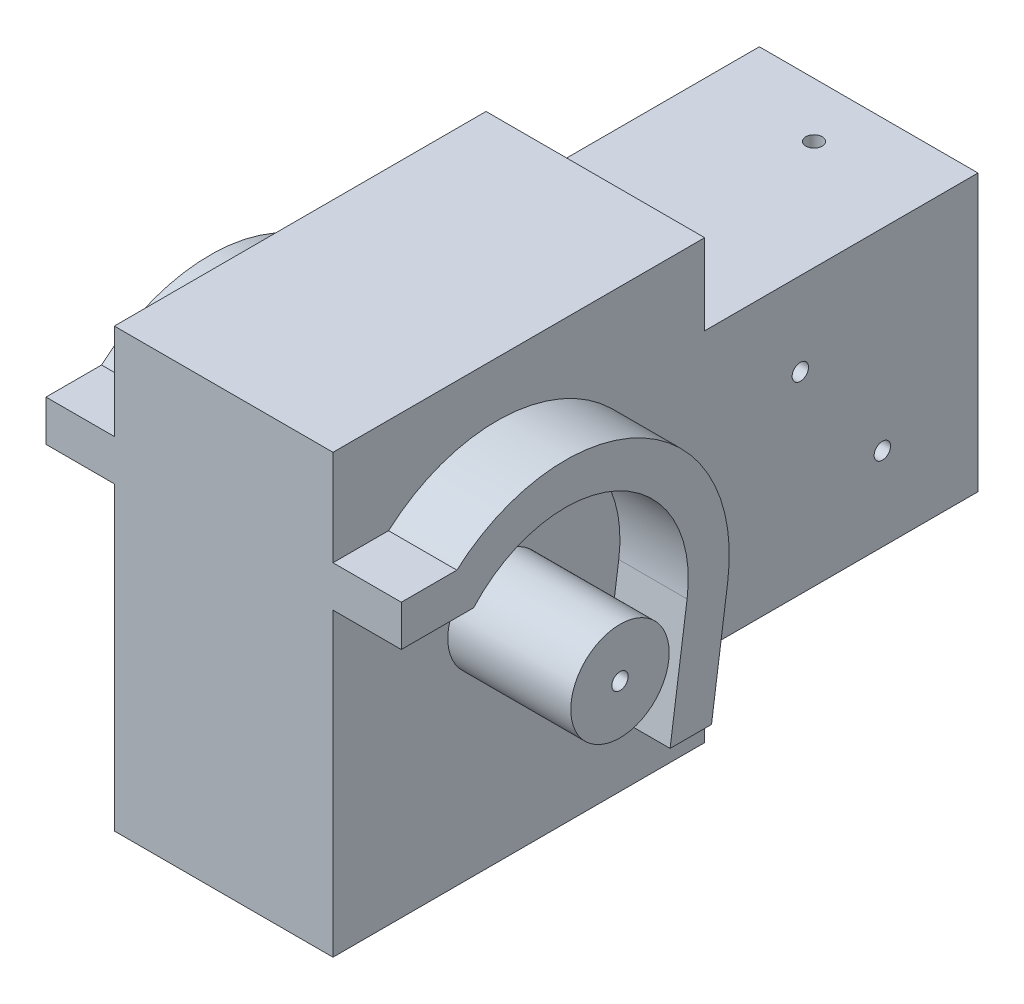
ISO-10303-21;
HEADER;
FILE_DESCRIPTION(('STEP AP214'),'2;1');
FILE_NAME('part.step','',(''),(''),'','','');
FILE_SCHEMA(('AUTOMOTIVE_DESIGN { 1 0 10303 214 1 1 1 1 }'));
ENDSEC;
DATA;
#1=APPLICATION_CONTEXT('core data for automotive mechanical design processes');
#2=APPLICATION_PROTOCOL_DEFINITION('international standard','automotive_design',2000,#1);
#3=PRODUCT_CONTEXT('',#1,'mechanical');
#4=PRODUCT('Part','Part','',(#3));
#5=PRODUCT_RELATED_PRODUCT_CATEGORY('part','',(#4));
#6=PRODUCT_DEFINITION_FORMATION('','',#4);
#7=PRODUCT_DEFINITION_CONTEXT('part definition',#1,'design');
#8=PRODUCT_DEFINITION('design','',#6,#7);
#9=PRODUCT_DEFINITION_SHAPE('','',#8);
#10=(LENGTH_UNIT() NAMED_UNIT(*) SI_UNIT(.MILLI.,.METRE.));
#11=(NAMED_UNIT(*) PLANE_ANGLE_UNIT() SI_UNIT($,.RADIAN.));
#12=(NAMED_UNIT(*) SI_UNIT($,.STERADIAN.) SOLID_ANGLE_UNIT());
#13=UNCERTAINTY_MEASURE_WITH_UNIT(LENGTH_MEASURE(1.E-05),#10,'distance_accuracy_value','');
#14=(GEOMETRIC_REPRESENTATION_CONTEXT(3) GLOBAL_UNCERTAINTY_ASSIGNED_CONTEXT((#13)) GLOBAL_UNIT_ASSIGNED_CONTEXT((#10,
#11,#12)) REPRESENTATION_CONTEXT('',''));
#15=CARTESIAN_POINT('',(0.,0.,0.));
#16=DIRECTION('',(0.,0.,1.));
#17=DIRECTION('',(1.,0.,0.));
#18=AXIS2_PLACEMENT_3D('',#15,#16,#17);
#19=CARTESIAN_POINT('',(4.,-8.,6.));
#20=DIRECTION('',(0.,1.,0.));
#21=DIRECTION('',(0.,0.,1.));
#22=AXIS2_PLACEMENT_3D('',#19,#20,#21);
#23=PLANE('',#22);
#24=DIRECTION('',(-1.,0.,0.));
#25=VECTOR('',#24,1.);
#26=CARTESIAN_POINT('',(0.,-8.,-7.6));
#27=LINE('',#26,#25);
#28=CARTESIAN_POINT('',(4.,-8.,-7.6));
#29=VERTEX_POINT('',#28);
#30=CARTESIAN_POINT('',(-4.,-8.,-7.6));
#31=VERTEX_POINT('',#30);
#32=EDGE_CURVE('E303',#29,#31,#27,.T.);
#33=ORIENTED_EDGE('',*,*,#32,.F.);
#34=DIRECTION('',(0.,0.,-1.));
#35=VECTOR('',#34,1.);
#36=CARTESIAN_POINT('',(4.,-8.,6.));
#37=LINE('',#36,#35);
#38=CARTESIAN_POINT('',(4.,-8.,6.));
#39=VERTEX_POINT('',#38);
#40=EDGE_CURVE('E371',#39,#29,#37,.T.);
#41=ORIENTED_EDGE('',*,*,#40,.F.);
#42=DIRECTION('',(-1.,0.,0.));
#43=VECTOR('',#42,1.);
#44=CARTESIAN_POINT('',(4.,-8.,6.));
#45=LINE('',#44,#43);
#46=CARTESIAN_POINT('',(-4.,-8.,6.));
#47=VERTEX_POINT('',#46);
#48=EDGE_CURVE('E381',#39,#47,#45,.T.);
#49=ORIENTED_EDGE('',*,*,#48,.T.);
#50=DIRECTION('',(0.,0.,-1.));
#51=VECTOR('',#50,1.);
#52=CARTESIAN_POINT('',(-4.,-8.,6.));
#53=LINE('',#52,#51);
#54=EDGE_CURVE('E262',#47,#31,#53,.T.);
#55=ORIENTED_EDGE('',*,*,#54,.T.);
#56=EDGE_LOOP('',(#33,#41,#49,#55));
#57=FACE_BOUND('',#56,.T.);
#58=ADVANCED_FACE('F34',(#57),#23,.F.);
#59=CARTESIAN_POINT('',(4.,8.,6.));
#60=DIRECTION('',(0.,0.,-1.));
#61=DIRECTION('',(-1.,0.,0.));
#62=AXIS2_PLACEMENT_3D('',#59,#60,#61);
#63=PLANE('',#62);
#64=DIRECTION('',(-1.,0.,0.));
#65=VECTOR('',#64,1.);
#66=CARTESIAN_POINT('',(4.,8.,6.));
#67=LINE('',#66,#65);
#68=CARTESIAN_POINT('',(4.,8.,6.));
#69=VERTEX_POINT('',#68);
#70=CARTESIAN_POINT('',(-4.,8.,6.));
#71=VERTEX_POINT('',#70);
#72=EDGE_CURVE('E379',#69,#71,#67,.T.);
#73=ORIENTED_EDGE('',*,*,#72,.T.);
#74=DIRECTION('',(0.,-1.,0.));
#75=VECTOR('',#74,1.);
#76=CARTESIAN_POINT('',(-4.,8.,6.));
#77=LINE('',#76,#75);
#78=CARTESIAN_POINT('',(-4.,4.5,6.));
#79=VERTEX_POINT('',#78);
#80=EDGE_CURVE('E259',#71,#79,#77,.T.);
#81=ORIENTED_EDGE('',*,*,#80,.T.);
#82=DIRECTION('',(1.,0.,0.));
#83=VECTOR('',#82,1.);
#84=CARTESIAN_POINT('',(-6.5,4.5,6.));
#85=LINE('',#84,#83);
#86=CARTESIAN_POINT('',(-6.5,4.5,6.));
#87=VERTEX_POINT('',#86);
#88=EDGE_CURVE('E243',#87,#79,#85,.T.);
#89=ORIENTED_EDGE('',*,*,#88,.F.);
#90=DIRECTION('',(0.,1.,0.));
#91=VECTOR('',#90,1.);
#92=CARTESIAN_POINT('',(-6.5,0.,6.));
#93=LINE('',#92,#91);
#94=CARTESIAN_POINT('',(-6.5,3.,6.));
#95=VERTEX_POINT('',#94);
#96=EDGE_CURVE('E230',#95,#87,#93,.T.);
#97=ORIENTED_EDGE('',*,*,#96,.F.);
#98=DIRECTION('',(1.,0.,0.));
#99=VECTOR('',#98,1.);
#100=CARTESIAN_POINT('',(-6.5,3.,6.));
#101=LINE('',#100,#99);
#102=CARTESIAN_POINT('',(-4.,3.,6.));
#103=VERTEX_POINT('',#102);
#104=EDGE_CURVE('E231',#95,#103,#101,.T.);
#105=ORIENTED_EDGE('',*,*,#104,.T.);
#106=EDGE_CURVE('E256',#103,#47,#77,.T.);
#107=ORIENTED_EDGE('',*,*,#106,.T.);
#108=ORIENTED_EDGE('',*,*,#48,.F.);
#109=DIRECTION('',(0.,-1.,0.));
#110=VECTOR('',#109,1.);
#111=CARTESIAN_POINT('',(4.,8.,6.));
#112=LINE('',#111,#110);
#113=CARTESIAN_POINT('',(4.,3.,6.));
#114=VERTEX_POINT('',#113);
#115=EDGE_CURVE('E366',#114,#39,#112,.T.);
#116=ORIENTED_EDGE('',*,*,#115,.F.);
#117=DIRECTION('',(-1.,0.,0.));
#118=VECTOR('',#117,1.);
#119=CARTESIAN_POINT('',(6.5,3.,6.));
#120=LINE('',#119,#118);
#121=CARTESIAN_POINT('',(6.5,3.,6.));
#122=VERTEX_POINT('',#121);
#123=EDGE_CURVE('E340',#122,#114,#120,.T.);
#124=ORIENTED_EDGE('',*,*,#123,.F.);
#125=DIRECTION('',(0.,1.,0.));
#126=VECTOR('',#125,1.);
#127=CARTESIAN_POINT('',(6.5,0.,6.));
#128=LINE('',#127,#126);
#129=CARTESIAN_POINT('',(6.5,4.5,6.));
#130=VERTEX_POINT('',#129);
#131=EDGE_CURVE('E308',#122,#130,#128,.T.);
#132=ORIENTED_EDGE('',*,*,#131,.T.);
#133=DIRECTION('',(-1.,0.,0.));
#134=VECTOR('',#133,1.);
#135=CARTESIAN_POINT('',(6.5,4.5,6.));
#136=LINE('',#135,#134);
#137=CARTESIAN_POINT('',(4.,4.5,6.));
#138=VERTEX_POINT('',#137);
#139=EDGE_CURVE('E327',#130,#138,#136,.T.);
#140=ORIENTED_EDGE('',*,*,#139,.T.);
#141=EDGE_CURVE('E369',#69,#138,#112,.T.);
#142=ORIENTED_EDGE('',*,*,#141,.F.);
#143=EDGE_LOOP('',(#73,#81,#89,#97,#105,#107,#108,#116,#124,#132,#140,#142));
#144=FACE_BOUND('',#143,.T.);
#145=ADVANCED_FACE('F36',(#144),#63,.F.);
#146=CARTESIAN_POINT('',(4.,8.,-17.6));
#147=DIRECTION('',(0.,0.,-1.));
#148=DIRECTION('',(-1.,0.,0.));
#149=AXIS2_PLACEMENT_3D('',#146,#147,#148);
#150=PLANE('',#149);
#151=DIRECTION('',(-1.,0.,0.));
#152=VECTOR('',#151,1.);
#153=CARTESIAN_POINT('',(0.,5.05,-17.6));
#154=LINE('',#153,#152);
#155=CARTESIAN_POINT('',(4.,5.05,-17.6));
#156=VERTEX_POINT('',#155);
#157=CARTESIAN_POINT('',(-4.,5.05,-17.6));
#158=VERTEX_POINT('',#157);
#159=EDGE_CURVE('E288',#156,#158,#154,.T.);
#160=ORIENTED_EDGE('',*,*,#159,.F.);
#161=DIRECTION('',(0.,-1.,0.));
#162=VECTOR('',#161,1.);
#163=CARTESIAN_POINT('',(4.,8.,-17.6));
#164=LINE('',#163,#162);
#165=CARTESIAN_POINT('',(4.,-5.05,-17.6));
#166=VERTEX_POINT('',#165);
#167=EDGE_CURVE('E373',#156,#166,#164,.T.);
#168=ORIENTED_EDGE('',*,*,#167,.T.);
#169=DIRECTION('',(1.,0.,0.));
#170=VECTOR('',#169,1.);
#171=CARTESIAN_POINT('',(0.,-5.05,-17.6));
#172=LINE('',#171,#170);
#173=CARTESIAN_POINT('',(-4.,-5.05,-17.6));
#174=VERTEX_POINT('',#173);
#175=EDGE_CURVE('E282',#174,#166,#172,.T.);
#176=ORIENTED_EDGE('',*,*,#175,.F.);
#177=DIRECTION('',(0.,-1.,0.));
#178=VECTOR('',#177,1.);
#179=CARTESIAN_POINT('',(-4.,8.,-17.6));
#180=LINE('',#179,#178);
#181=EDGE_CURVE('E265',#158,#174,#180,.T.);
#182=ORIENTED_EDGE('',*,*,#181,.F.);
#183=EDGE_LOOP('',(#160,#168,#176,#182));
#184=FACE_BOUND('',#183,.T.);
#185=ADVANCED_FACE('F410',(#184),#150,.T.);
#186=CARTESIAN_POINT('',(4.,8.,6.));
#187=DIRECTION('',(0.,1.,0.));
#188=DIRECTION('',(0.,0.,1.));
#189=AXIS2_PLACEMENT_3D('',#186,#187,#188);
#190=PLANE('',#189);
#191=DIRECTION('',(1.,0.,0.));
#192=VECTOR('',#191,1.);
#193=CARTESIAN_POINT('',(0.,8.,-7.6));
#194=LINE('',#193,#192);
#195=CARTESIAN_POINT('',(-4.,8.,-7.6));
#196=VERTEX_POINT('',#195);
#197=CARTESIAN_POINT('',(4.,8.,-7.6));
#198=VERTEX_POINT('',#197);
#199=EDGE_CURVE('E285',#196,#198,#194,.T.);
#200=ORIENTED_EDGE('',*,*,#199,.F.);
#201=DIRECTION('',(0.,0.,-1.));
#202=VECTOR('',#201,1.);
#203=CARTESIAN_POINT('',(-4.,8.,6.));
#204=LINE('',#203,#202);
#205=EDGE_CURVE('E268',#71,#196,#204,.T.);
#206=ORIENTED_EDGE('',*,*,#205,.F.);
#207=ORIENTED_EDGE('',*,*,#72,.F.);
#208=DIRECTION('',(0.,0.,-1.));
#209=VECTOR('',#208,1.);
#210=CARTESIAN_POINT('',(4.,8.,6.));
#211=LINE('',#210,#209);
#212=EDGE_CURVE('E376',#69,#198,#211,.T.);
#213=ORIENTED_EDGE('',*,*,#212,.T.);
#214=EDGE_LOOP('',(#200,#206,#207,#213));
#215=FACE_BOUND('',#214,.T.);
#216=ADVANCED_FACE('F416',(#215),#190,.T.);
#217=CARTESIAN_POINT('',(4.,0.,0.));
#218=DIRECTION('',(1.,0.,0.));
#219=DIRECTION('',(0.,0.,-1.));
#220=AXIS2_PLACEMENT_3D('',#217,#218,#219);
#221=PLANE('',#220);
#222=CARTESIAN_POINT('',(4.,-2.,-14.1));
#223=DIRECTION('',(1.,0.,0.));
#224=DIRECTION('',(0.,0.,-1.));
#225=AXIS2_PLACEMENT_3D('',#222,#223,#224);
#226=CIRCLE('',#225,0.3);
#227=CARTESIAN_POINT('',(4.,-2.,-14.4));
#228=VERTEX_POINT('',#227);
#229=EDGE_CURVE('E565',#228,#228,#226,.F.);
#230=ORIENTED_EDGE('',*,*,#229,.T.);
#231=EDGE_LOOP('',(#230));
#232=FACE_BOUND('',#231,.T.);
#233=CARTESIAN_POINT('',(4.,2.,-11.1));
#234=DIRECTION('',(1.,0.,0.));
#235=DIRECTION('',(0.,0.,-1.));
#236=AXIS2_PLACEMENT_3D('',#233,#234,#235);
#237=CIRCLE('',#236,0.3);
#238=CARTESIAN_POINT('',(4.,2.,-11.4));
#239=VERTEX_POINT('',#238);
#240=EDGE_CURVE('E562',#239,#239,#237,.F.);
#241=ORIENTED_EDGE('',*,*,#240,.T.);
#242=EDGE_LOOP('',(#241));
#243=FACE_BOUND('',#242,.T.);
#244=DIRECTION('',(0.,-0.990268068741571,0.139173100960062));
#245=VECTOR('',#244,1.);
#246=CARTESIAN_POINT('',(4.,-0.835038605760369,-5.94160841244942));
#247=LINE('',#246,#245);
#248=CARTESIAN_POINT('',(4.,-0.835038605760374,-5.94160841244943));
#249=VERTEX_POINT('',#248);
#250=CARTESIAN_POINT('',(4.,-5.05,-5.34923421986465));
#251=VERTEX_POINT('',#250);
#252=EDGE_CURVE('E332',#249,#251,#247,.T.);
#253=ORIENTED_EDGE('',*,*,#252,.T.);
#254=DIRECTION('',(0.,0.,-1.));
#255=VECTOR('',#254,1.);
#256=CARTESIAN_POINT('',(4.,-5.05,-7.6));
#257=LINE('',#256,#255);
#258=CARTESIAN_POINT('',(4.,-5.05,-3.83449286108672));
#259=VERTEX_POINT('',#258);
#260=EDGE_CURVE('E273',#259,#251,#257,.T.);
#261=ORIENTED_EDGE('',*,*,#260,.F.);
#262=DIRECTION('',(0.,0.990268068741571,-0.139173100960062));
#263=VECTOR('',#262,1.);
#264=CARTESIAN_POINT('',(4.,-0.626278954320277,-4.45620630933707));
#265=LINE('',#264,#263);
#266=CARTESIAN_POINT('',(4.,-0.626278954320281,-4.45620630933707));
#267=VERTEX_POINT('',#266);
#268=EDGE_CURVE('E335',#259,#267,#265,.T.);
#269=ORIENTED_EDGE('',*,*,#268,.T.);
#270=CARTESIAN_POINT('',(4.,0.,0.));
#271=DIRECTION('',(1.,0.,0.));
#272=DIRECTION('',(0.,0.,-1.));
#273=AXIS2_PLACEMENT_3D('',#270,#271,#272);
#274=CIRCLE('',#273,4.5);
#275=CARTESIAN_POINT('',(4.,3.,3.35410196624968));
#276=VERTEX_POINT('',#275);
#277=EDGE_CURVE('E56',#267,#276,#274,.T.);
#278=ORIENTED_EDGE('',*,*,#277,.T.);
#279=DIRECTION('',(0.,0.,-1.));
#280=VECTOR('',#279,1.);
#281=CARTESIAN_POINT('',(4.,3.,0.));
#282=LINE('',#281,#280);
#283=EDGE_CURVE('E312',#114,#276,#282,.T.);
#284=ORIENTED_EDGE('',*,*,#283,.F.);
#285=ORIENTED_EDGE('',*,*,#115,.T.);
#286=ORIENTED_EDGE('',*,*,#40,.T.);
#287=DIRECTION('',(0.,-1.,0.));
#288=VECTOR('',#287,1.);
#289=CARTESIAN_POINT('',(4.,-8.,-7.6));
#290=LINE('',#289,#288);
#291=CARTESIAN_POINT('',(4.,-5.05,-7.6));
#292=VERTEX_POINT('',#291);
#293=EDGE_CURVE('E300',#292,#29,#290,.T.);
#294=ORIENTED_EDGE('',*,*,#293,.F.);
#295=DIRECTION('',(0.,0.,-1.));
#296=VECTOR('',#295,1.);
#297=CARTESIAN_POINT('',(4.,-5.05,-7.6));
#298=LINE('',#297,#296);
#299=EDGE_CURVE('E294',#292,#166,#298,.T.);
#300=ORIENTED_EDGE('',*,*,#299,.T.);
#301=ORIENTED_EDGE('',*,*,#167,.F.);
#302=DIRECTION('',(0.,0.,-1.));
#303=VECTOR('',#302,1.);
#304=CARTESIAN_POINT('',(4.,5.05,-7.6));
#305=LINE('',#304,#303);
#306=CARTESIAN_POINT('',(4.,5.05,-7.6));
#307=VERTEX_POINT('',#306);
#308=EDGE_CURVE('E292',#307,#156,#305,.T.);
#309=ORIENTED_EDGE('',*,*,#308,.F.);
#310=DIRECTION('',(0.,-1.,0.));
#311=VECTOR('',#310,1.);
#312=CARTESIAN_POINT('',(4.,8.,-7.6));
#313=LINE('',#312,#311);
#314=EDGE_CURVE('E287',#198,#307,#313,.T.);
#315=ORIENTED_EDGE('',*,*,#314,.F.);
#316=ORIENTED_EDGE('',*,*,#212,.F.);
#317=ORIENTED_EDGE('',*,*,#141,.T.);
#318=DIRECTION('',(0.,0.,-1.));
#319=VECTOR('',#318,1.);
#320=CARTESIAN_POINT('',(4.,4.5,0.));
#321=LINE('',#320,#319);
#322=CARTESIAN_POINT('',(4.,4.5,3.96862696659688));
#323=VERTEX_POINT('',#322);
#324=EDGE_CURVE('E296',#138,#323,#321,.T.);
#325=ORIENTED_EDGE('',*,*,#324,.T.);
#326=CARTESIAN_POINT('',(4.,0.,0.));
#327=DIRECTION('',(1.,0.,0.));
#328=DIRECTION('',(0.,0.,-1.));
#329=AXIS2_PLACEMENT_3D('',#326,#327,#328);
#330=CIRCLE('',#329,6.);
#331=EDGE_CURVE('E329',#249,#323,#330,.T.);
#332=ORIENTED_EDGE('',*,*,#331,.F.);
#333=EDGE_LOOP('',(#253,#261,#269,#278,#284,#285,#286,#294,#300,#301,#309,#315,#316,#317,#325,#332));
#334=FACE_BOUND('',#333,.T.);
#335=CARTESIAN_POINT('',(4.,0.,0.));
#336=DIRECTION('',(1.,0.,0.));
#337=DIRECTION('',(0.,0.,-1.));
#338=AXIS2_PLACEMENT_3D('',#335,#336,#337);
#339=CIRCLE('',#338,1.8);
#340=CARTESIAN_POINT('',(4.,0.,-1.8));
#341=VERTEX_POINT('',#340);
#342=EDGE_CURVE('E360',#341,#341,#339,.T.);
#343=ORIENTED_EDGE('',*,*,#342,.F.);
#344=EDGE_LOOP('',(#343));
#345=FACE_BOUND('',#344,.T.);
#346=ADVANCED_FACE('F420',(#232,#243,#334,#345),#221,.T.);
#347=CARTESIAN_POINT('',(8.5,0.,0.));
#348=DIRECTION('',(-1.,0.,0.));
#349=DIRECTION('',(0.,0.,1.));
#350=AXIS2_PLACEMENT_3D('',#347,#348,#349);
#351=CYLINDRICAL_SURFACE('',#350,1.8);
#352=CARTESIAN_POINT('',(8.5,0.,0.));
#353=DIRECTION('',(1.,0.,0.));
#354=DIRECTION('',(0.,0.,-1.));
#355=AXIS2_PLACEMENT_3D('',#352,#353,#354);
#356=CIRCLE('',#355,1.8);
#357=CARTESIAN_POINT('',(8.5,0.,-1.8));
#358=VERTEX_POINT('',#357);
#359=EDGE_CURVE('E363',#358,#358,#356,.T.);
#360=ORIENTED_EDGE('',*,*,#359,.F.);
#361=EDGE_LOOP('',(#360));
#362=FACE_BOUND('',#361,.T.);
#363=ORIENTED_EDGE('',*,*,#342,.T.);
#364=EDGE_LOOP('',(#363));
#365=FACE_BOUND('',#364,.T.);
#366=ADVANCED_FACE('F424',(#362,#365),#351,.T.);
#367=CARTESIAN_POINT('',(8.5,0.,0.));
#368=DIRECTION('',(1.,0.,0.));
#369=DIRECTION('',(0.,0.,-1.));
#370=AXIS2_PLACEMENT_3D('',#367,#368,#369);
#371=PLANE('',#370);
#372=CARTESIAN_POINT('',(8.5,0.,0.));
#373=DIRECTION('',(1.,0.,0.));
#374=DIRECTION('',(0.,0.,-1.));
#375=AXIS2_PLACEMENT_3D('',#372,#373,#374);
#376=CIRCLE('',#375,0.3);
#377=CARTESIAN_POINT('',(8.5,0.,-0.3));
#378=VERTEX_POINT('',#377);
#379=EDGE_CURVE('E343',#378,#378,#376,.T.);
#380=ORIENTED_EDGE('',*,*,#379,.F.);
#381=EDGE_LOOP('',(#380));
#382=FACE_BOUND('',#381,.T.);
#383=ORIENTED_EDGE('',*,*,#359,.T.);
#384=EDGE_LOOP('',(#383));
#385=FACE_BOUND('',#384,.T.);
#386=ADVANCED_FACE('F428',(#382,#385),#371,.T.);
#387=CARTESIAN_POINT('',(7.5,0.,0.));
#388=DIRECTION('',(1.,0.,0.));
#389=DIRECTION('',(0.,0.,-1.));
#390=AXIS2_PLACEMENT_3D('',#387,#388,#389);
#391=CYLINDRICAL_SURFACE('',#390,0.3);
#392=CARTESIAN_POINT('',(7.5,0.,0.));
#393=DIRECTION('',(1.,0.,0.));
#394=DIRECTION('',(0.,0.,-1.));
#395=AXIS2_PLACEMENT_3D('',#392,#393,#394);
#396=CIRCLE('',#395,0.3);
#397=CARTESIAN_POINT('',(7.5,0.,-0.3));
#398=VERTEX_POINT('',#397);
#399=EDGE_CURVE('E357',#398,#398,#396,.T.);
#400=ORIENTED_EDGE('',*,*,#399,.F.);
#401=EDGE_LOOP('',(#400));
#402=FACE_BOUND('',#401,.T.);
#403=ORIENTED_EDGE('',*,*,#379,.T.);
#404=EDGE_LOOP('',(#403));
#405=FACE_BOUND('',#404,.T.);
#406=ADVANCED_FACE('F432',(#402,#405),#391,.F.);
#407=CARTESIAN_POINT('',(7.5,0.,0.));
#408=DIRECTION('',(1.,0.,0.));
#409=DIRECTION('',(0.,0.,-1.));
#410=AXIS2_PLACEMENT_3D('',#407,#408,#409);
#411=PLANE('',#410);
#412=ORIENTED_EDGE('',*,*,#399,.T.);
#413=EDGE_LOOP('',(#412));
#414=FACE_BOUND('',#413,.T.);
#415=ADVANCED_FACE('F436',(#414),#411,.T.);
#416=CARTESIAN_POINT('',(6.5,3.,0.));
#417=DIRECTION('',(0.,1.,0.));
#418=DIRECTION('',(0.,0.,1.));
#419=AXIS2_PLACEMENT_3D('',#416,#417,#418);
#420=PLANE('',#419);
#421=ORIENTED_EDGE('',*,*,#283,.T.);
#422=DIRECTION('',(-1.,0.,0.));
#423=VECTOR('',#422,1.);
#424=CARTESIAN_POINT('',(6.5,3.,3.35410196624968));
#425=LINE('',#424,#423);
#426=CARTESIAN_POINT('',(6.5,3.,3.35410196624968));
#427=VERTEX_POINT('',#426);
#428=EDGE_CURVE('E344',#427,#276,#425,.T.);
#429=ORIENTED_EDGE('',*,*,#428,.F.);
#430=DIRECTION('',(0.,0.,-1.));
#431=VECTOR('',#430,1.);
#432=CARTESIAN_POINT('',(6.5,3.,0.));
#433=LINE('',#432,#431);
#434=EDGE_CURVE('E325',#122,#427,#433,.T.);
#435=ORIENTED_EDGE('',*,*,#434,.F.);
#436=ORIENTED_EDGE('',*,*,#123,.T.);
#437=EDGE_LOOP('',(#421,#429,#435,#436));
#438=FACE_BOUND('',#437,.T.);
#439=ADVANCED_FACE('F440',(#438),#420,.F.);
#440=CARTESIAN_POINT('',(6.5,0.,0.));
#441=DIRECTION('',(-1.,0.,0.));
#442=DIRECTION('',(0.,0.,1.));
#443=AXIS2_PLACEMENT_3D('',#440,#441,#442);
#444=CYLINDRICAL_SURFACE('',#443,4.5);
#445=ORIENTED_EDGE('',*,*,#277,.F.);
#446=DIRECTION('',(-1.,0.,0.));
#447=VECTOR('',#446,1.);
#448=CARTESIAN_POINT('',(6.5,-0.626278954320281,-4.45620630933707));
#449=LINE('',#448,#447);
#450=CARTESIAN_POINT('',(6.5,-0.626278954320281,-4.45620630933707));
#451=VERTEX_POINT('',#450);
#452=EDGE_CURVE('E346',#451,#267,#449,.T.);
#453=ORIENTED_EDGE('',*,*,#452,.F.);
#454=CARTESIAN_POINT('',(6.5,0.,0.));
#455=DIRECTION('',(1.,0.,0.));
#456=DIRECTION('',(0.,0.,-1.));
#457=AXIS2_PLACEMENT_3D('',#454,#455,#456);
#458=CIRCLE('',#457,4.5);
#459=EDGE_CURVE('E322',#451,#427,#458,.T.);
#460=ORIENTED_EDGE('',*,*,#459,.T.);
#461=ORIENTED_EDGE('',*,*,#428,.T.);
#462=EDGE_LOOP('',(#445,#453,#460,#461));
#463=FACE_BOUND('',#462,.T.);
#464=ADVANCED_FACE('F458',(#463),#444,.F.);
#465=CARTESIAN_POINT('',(6.5,-0.626278954320277,-4.45620630933707));
#466=DIRECTION('',(0.,0.139173100960062,0.990268068741571));
#467=DIRECTION('',(0.,-0.990268068741571,0.139173100960062));
#468=AXIS2_PLACEMENT_3D('',#465,#466,#467);
#469=PLANE('',#468);
#470=DIRECTION('',(-1.,0.,0.));
#471=VECTOR('',#470,1.);
#472=CARTESIAN_POINT('',(6.5,-5.05,-3.83449286108672));
#473=LINE('',#472,#471);
#474=CARTESIAN_POINT('',(6.5,-5.05,-3.83449286108672));
#475=VERTEX_POINT('',#474);
#476=EDGE_CURVE('E276',#475,#259,#473,.T.);
#477=ORIENTED_EDGE('',*,*,#476,.F.);
#478=DIRECTION('',(0.,0.990268068741571,-0.139173100960062));
#479=VECTOR('',#478,1.);
#480=CARTESIAN_POINT('',(6.5,-0.626278954320277,-4.45620630933707));
#481=LINE('',#480,#479);
#482=EDGE_CURVE('E320',#475,#451,#481,.T.);
#483=ORIENTED_EDGE('',*,*,#482,.T.);
#484=ORIENTED_EDGE('',*,*,#452,.T.);
#485=ORIENTED_EDGE('',*,*,#268,.F.);
#486=EDGE_LOOP('',(#477,#483,#484,#485));
#487=FACE_BOUND('',#486,.T.);
#488=ADVANCED_FACE('F454',(#487),#469,.T.);
#489=CARTESIAN_POINT('',(6.5,-0.835038605760369,-5.94160841244942));
#490=DIRECTION('',(0.,-0.139173100960062,-0.990268068741571));
#491=DIRECTION('',(0.,0.990268068741571,-0.139173100960062));
#492=AXIS2_PLACEMENT_3D('',#489,#490,#491);
#493=PLANE('',#492);
#494=DIRECTION('',(1.,0.,0.));
#495=VECTOR('',#494,1.);
#496=CARTESIAN_POINT('',(6.5,-5.05,-5.34923421986465));
#497=LINE('',#496,#495);
#498=CARTESIAN_POINT('',(6.5,-5.05,-5.34923421986465));
#499=VERTEX_POINT('',#498);
#500=EDGE_CURVE('E48',#251,#499,#497,.T.);
#501=ORIENTED_EDGE('',*,*,#500,.F.);
#502=ORIENTED_EDGE('',*,*,#252,.F.);
#503=DIRECTION('',(-1.,0.,0.));
#504=VECTOR('',#503,1.);
#505=CARTESIAN_POINT('',(6.5,-0.835038605760374,-5.94160841244942));
#506=LINE('',#505,#504);
#507=CARTESIAN_POINT('',(6.5,-0.835038605760374,-5.94160841244942));
#508=VERTEX_POINT('',#507);
#509=EDGE_CURVE('E349',#508,#249,#506,.T.);
#510=ORIENTED_EDGE('',*,*,#509,.F.);
#511=DIRECTION('',(0.,-0.990268068741571,0.139173100960062));
#512=VECTOR('',#511,1.);
#513=CARTESIAN_POINT('',(6.5,-0.835038605760369,-5.94160841244942));
#514=LINE('',#513,#512);
#515=EDGE_CURVE('E317',#508,#499,#514,.T.);
#516=ORIENTED_EDGE('',*,*,#515,.T.);
#517=EDGE_LOOP('',(#501,#502,#510,#516));
#518=FACE_BOUND('',#517,.T.);
#519=ADVANCED_FACE('F450',(#518),#493,.T.);
#520=CARTESIAN_POINT('',(6.5,0.,0.));
#521=DIRECTION('',(-1.,0.,0.));
#522=DIRECTION('',(0.,0.,1.));
#523=AXIS2_PLACEMENT_3D('',#520,#521,#522);
#524=CYLINDRICAL_SURFACE('',#523,6.);
#525=ORIENTED_EDGE('',*,*,#331,.T.);
#526=DIRECTION('',(-1.,0.,0.));
#527=VECTOR('',#526,1.);
#528=CARTESIAN_POINT('',(6.5,4.5,3.96862696659688));
#529=LINE('',#528,#527);
#530=CARTESIAN_POINT('',(6.5,4.5,3.96862696659688));
#531=VERTEX_POINT('',#530);
#532=EDGE_CURVE('E352',#531,#323,#529,.T.);
#533=ORIENTED_EDGE('',*,*,#532,.F.);
#534=CARTESIAN_POINT('',(6.5,0.,0.));
#535=DIRECTION('',(1.,0.,0.));
#536=DIRECTION('',(0.,0.,-1.));
#537=AXIS2_PLACEMENT_3D('',#534,#535,#536);
#538=CIRCLE('',#537,6.);
#539=EDGE_CURVE('E315',#508,#531,#538,.T.);
#540=ORIENTED_EDGE('',*,*,#539,.F.);
#541=ORIENTED_EDGE('',*,*,#509,.T.);
#542=EDGE_LOOP('',(#525,#533,#540,#541));
#543=FACE_BOUND('',#542,.T.);
#544=ADVANCED_FACE('F446',(#543),#524,.T.);
#545=CARTESIAN_POINT('',(6.5,4.5,0.));
#546=DIRECTION('',(0.,1.,0.));
#547=DIRECTION('',(0.,0.,1.));
#548=AXIS2_PLACEMENT_3D('',#545,#546,#547);
#549=PLANE('',#548);
#550=ORIENTED_EDGE('',*,*,#324,.F.);
#551=ORIENTED_EDGE('',*,*,#139,.F.);
#552=DIRECTION('',(0.,0.,-1.));
#553=VECTOR('',#552,1.);
#554=CARTESIAN_POINT('',(6.5,4.5,0.));
#555=LINE('',#554,#553);
#556=EDGE_CURVE('E311',#130,#531,#555,.T.);
#557=ORIENTED_EDGE('',*,*,#556,.T.);
#558=ORIENTED_EDGE('',*,*,#532,.T.);
#559=EDGE_LOOP('',(#550,#551,#557,#558));
#560=FACE_BOUND('',#559,.T.);
#561=ADVANCED_FACE('F442',(#560),#549,.T.);
#562=CARTESIAN_POINT('',(6.5,0.,0.));
#563=DIRECTION('',(1.,0.,0.));
#564=DIRECTION('',(0.,0.,-1.));
#565=AXIS2_PLACEMENT_3D('',#562,#563,#564);
#566=PLANE('',#565);
#567=DIRECTION('',(0.,0.,1.));
#568=VECTOR('',#567,1.);
#569=CARTESIAN_POINT('',(6.5,-5.05,0.));
#570=LINE('',#569,#568);
#571=EDGE_CURVE('E11',#499,#475,#570,.T.);
#572=ORIENTED_EDGE('',*,*,#571,.F.);
#573=ORIENTED_EDGE('',*,*,#515,.F.);
#574=ORIENTED_EDGE('',*,*,#539,.T.);
#575=ORIENTED_EDGE('',*,*,#556,.F.);
#576=ORIENTED_EDGE('',*,*,#131,.F.);
#577=ORIENTED_EDGE('',*,*,#434,.T.);
#578=ORIENTED_EDGE('',*,*,#459,.F.);
#579=ORIENTED_EDGE('',*,*,#482,.F.);
#580=EDGE_LOOP('',(#572,#573,#574,#575,#576,#577,#578,#579));
#581=FACE_BOUND('',#580,.T.);
#582=ADVANCED_FACE('F445',(#581),#566,.T.);
#583=CARTESIAN_POINT('',(0.,-5.05,-7.6));
#584=DIRECTION('',(0.,1.,0.));
#585=DIRECTION('',(0.,0.,1.));
#586=AXIS2_PLACEMENT_3D('',#583,#584,#585);
#587=PLANE('',#586);
#588=CARTESIAN_POINT('',(0.,-5.05,-9.6));
#589=DIRECTION('',(0.,-1.,0.));
#590=DIRECTION('',(0.,0.,-1.));
#591=AXIS2_PLACEMENT_3D('',#588,#589,#590);
#592=CIRCLE('',#591,0.3);
#593=CARTESIAN_POINT('',(0.,-5.05,-9.9));
#594=VERTEX_POINT('',#593);
#595=EDGE_CURVE('E279',#594,#594,#592,.T.);
#596=ORIENTED_EDGE('',*,*,#595,.F.);
#597=EDGE_LOOP('',(#596));
#598=FACE_BOUND('',#597,.T.);
#599=CARTESIAN_POINT('',(0.,-5.05,-15.6));
#600=DIRECTION('',(0.,-1.,0.));
#601=DIRECTION('',(0.,0.,-1.));
#602=AXIS2_PLACEMENT_3D('',#599,#600,#601);
#603=CIRCLE('',#602,0.300000000000002);
#604=CARTESIAN_POINT('',(0.,-5.05,-15.9));
#605=VERTEX_POINT('',#604);
#606=EDGE_CURVE('E278',#605,#605,#603,.T.);
#607=ORIENTED_EDGE('',*,*,#606,.F.);
#608=EDGE_LOOP('',(#607));
#609=FACE_BOUND('',#608,.T.);
#610=DIRECTION('',(1.,0.,0.));
#611=VECTOR('',#610,1.);
#612=CARTESIAN_POINT('',(0.,-5.05,-7.6));
#613=LINE('',#612,#611);
#614=CARTESIAN_POINT('',(-4.,-5.05,-7.6));
#615=VERTEX_POINT('',#614);
#616=EDGE_CURVE('E297',#615,#292,#613,.T.);
#617=ORIENTED_EDGE('',*,*,#616,.F.);
#618=DIRECTION('',(0.,0.,-1.));
#619=VECTOR('',#618,1.);
#620=CARTESIAN_POINT('',(-4.,-5.05,-7.6));
#621=LINE('',#620,#619);
#622=EDGE_CURVE('E499',#615,#174,#621,.T.);
#623=ORIENTED_EDGE('',*,*,#622,.T.);
#624=ORIENTED_EDGE('',*,*,#175,.T.);
#625=ORIENTED_EDGE('',*,*,#299,.F.);
#626=EDGE_LOOP('',(#617,#623,#624,#625));
#627=FACE_BOUND('',#626,.T.);
#628=ADVANCED_FACE('F468',(#598,#609,#627),#587,.F.);
#629=CARTESIAN_POINT('',(0.,0.,-7.6));
#630=DIRECTION('',(0.,0.,-1.));
#631=DIRECTION('',(-1.,0.,0.));
#632=AXIS2_PLACEMENT_3D('',#629,#630,#631);
#633=PLANE('',#632);
#634=ORIENTED_EDGE('',*,*,#32,.T.);
#635=DIRECTION('',(0.,-1.,0.));
#636=VECTOR('',#635,1.);
#637=CARTESIAN_POINT('',(-4.,-8.,-7.6));
#638=LINE('',#637,#636);
#639=EDGE_CURVE('E204',#615,#31,#638,.T.);
#640=ORIENTED_EDGE('',*,*,#639,.F.);
#641=ORIENTED_EDGE('',*,*,#616,.T.);
#642=ORIENTED_EDGE('',*,*,#293,.T.);
#643=EDGE_LOOP('',(#634,#640,#641,#642));
#644=FACE_BOUND('',#643,.T.);
#645=ADVANCED_FACE('F472',(#644),#633,.T.);
#646=CARTESIAN_POINT('',(0.,5.05,-7.6));
#647=DIRECTION('',(0.,-1.,0.));
#648=DIRECTION('',(0.,0.,-1.));
#649=AXIS2_PLACEMENT_3D('',#646,#647,#648);
#650=PLANE('',#649);
#651=CARTESIAN_POINT('',(0.,5.05,-9.6));
#652=DIRECTION('',(0.,-1.,0.));
#653=DIRECTION('',(0.,0.,-1.));
#654=AXIS2_PLACEMENT_3D('',#651,#652,#653);
#655=CIRCLE('',#654,0.3);
#656=CARTESIAN_POINT('',(0.,5.05,-9.9));
#657=VERTEX_POINT('',#656);
#658=EDGE_CURVE('E42',#657,#657,#655,.T.);
#659=ORIENTED_EDGE('',*,*,#658,.T.);
#660=EDGE_LOOP('',(#659));
#661=FACE_BOUND('',#660,.T.);
#662=CARTESIAN_POINT('',(0.,5.05,-15.6));
#663=DIRECTION('',(0.,-1.,0.));
#664=DIRECTION('',(0.,0.,-1.));
#665=AXIS2_PLACEMENT_3D('',#662,#663,#664);
#666=CIRCLE('',#665,0.300000000000002);
#667=CARTESIAN_POINT('',(0.,5.05,-15.9));
#668=VERTEX_POINT('',#667);
#669=EDGE_CURVE('E383',#668,#668,#666,.T.);
#670=ORIENTED_EDGE('',*,*,#669,.T.);
#671=EDGE_LOOP('',(#670));
#672=FACE_BOUND('',#671,.T.);
#673=DIRECTION('',(0.,0.,-1.));
#674=VECTOR('',#673,1.);
#675=CARTESIAN_POINT('',(-4.,5.05,-7.6));
#676=LINE('',#675,#674);
#677=CARTESIAN_POINT('',(-4.,5.05,-7.6));
#678=VERTEX_POINT('',#677);
#679=EDGE_CURVE('E492',#678,#158,#676,.T.);
#680=ORIENTED_EDGE('',*,*,#679,.F.);
#681=DIRECTION('',(-1.,0.,0.));
#682=VECTOR('',#681,1.);
#683=CARTESIAN_POINT('',(0.,5.05,-7.6));
#684=LINE('',#683,#682);
#685=EDGE_CURVE('E290',#307,#678,#684,.T.);
#686=ORIENTED_EDGE('',*,*,#685,.F.);
#687=ORIENTED_EDGE('',*,*,#308,.T.);
#688=ORIENTED_EDGE('',*,*,#159,.T.);
#689=EDGE_LOOP('',(#680,#686,#687,#688));
#690=FACE_BOUND('',#689,.T.);
#691=ADVANCED_FACE('F388',(#661,#672,#690),#650,.F.);
#692=CARTESIAN_POINT('',(0.,0.,-7.6));
#693=DIRECTION('',(0.,0.,1.));
#694=DIRECTION('',(1.,0.,0.));
#695=AXIS2_PLACEMENT_3D('',#692,#693,#694);
#696=PLANE('',#695);
#697=ORIENTED_EDGE('',*,*,#685,.T.);
#698=DIRECTION('',(0.,-1.,0.));
#699=VECTOR('',#698,1.);
#700=CARTESIAN_POINT('',(-4.,8.,-7.6));
#701=LINE('',#700,#699);
#702=EDGE_CURVE('E487',#196,#678,#701,.T.);
#703=ORIENTED_EDGE('',*,*,#702,.F.);
#704=ORIENTED_EDGE('',*,*,#199,.T.);
#705=ORIENTED_EDGE('',*,*,#314,.T.);
#706=EDGE_LOOP('',(#697,#703,#704,#705));
#707=FACE_BOUND('',#706,.T.);
#708=ADVANCED_FACE('F402',(#707),#696,.F.);
#709=CARTESIAN_POINT('',(0.,8.,-15.6));
#710=DIRECTION('',(0.,-1.,0.));
#711=DIRECTION('',(0.,0.,-1.));
#712=AXIS2_PLACEMENT_3D('',#709,#710,#711);
#713=CYLINDRICAL_SURFACE('',#712,0.300000000000002);
#714=ORIENTED_EDGE('',*,*,#606,.T.);
#715=EDGE_LOOP('',(#714));
#716=FACE_BOUND('',#715,.T.);
#717=ORIENTED_EDGE('',*,*,#669,.F.);
#718=EDGE_LOOP('',(#717));
#719=FACE_BOUND('',#718,.T.);
#720=ADVANCED_FACE('F394',(#716,#719),#713,.F.);
#721=CARTESIAN_POINT('',(0.,8.,-9.6));
#722=DIRECTION('',(0.,-1.,0.));
#723=DIRECTION('',(0.,0.,-1.));
#724=AXIS2_PLACEMENT_3D('',#721,#722,#723);
#725=CYLINDRICAL_SURFACE('',#724,0.3);
#726=ORIENTED_EDGE('',*,*,#595,.T.);
#727=EDGE_LOOP('',(#726));
#728=FACE_BOUND('',#727,.T.);
#729=ORIENTED_EDGE('',*,*,#658,.F.);
#730=EDGE_LOOP('',(#729));
#731=FACE_BOUND('',#730,.T.);
#732=ADVANCED_FACE('F391',(#728,#731),#725,.F.);
#733=CARTESIAN_POINT('',(-9.91626745934412,-5.05,-7.6));
#734=DIRECTION('',(0.,1.,0.));
#735=DIRECTION('',(0.,0.,1.));
#736=AXIS2_PLACEMENT_3D('',#733,#734,#735);
#737=PLANE('',#736);
#738=ORIENTED_EDGE('',*,*,#476,.T.);
#739=ORIENTED_EDGE('',*,*,#260,.T.);
#740=ORIENTED_EDGE('',*,*,#500,.T.);
#741=ORIENTED_EDGE('',*,*,#571,.T.);
#742=EDGE_LOOP('',(#738,#739,#740,#741));
#743=FACE_BOUND('',#742,.T.);
#744=ADVANCED_FACE('F393',(#743),#737,.F.);
#745=CARTESIAN_POINT('',(-4.,0.,0.));
#746=DIRECTION('',(-1.,0.,0.));
#747=DIRECTION('',(0.,0.,-1.));
#748=AXIS2_PLACEMENT_3D('',#745,#746,#747);
#749=PLANE('',#748);
#750=CARTESIAN_POINT('',(-4.,-2.,-14.1));
#751=DIRECTION('',(-1.,0.,0.));
#752=DIRECTION('',(0.,0.,1.));
#753=AXIS2_PLACEMENT_3D('',#750,#751,#752);
#754=CIRCLE('',#753,0.3);
#755=CARTESIAN_POINT('',(-4.,-2.,-13.8));
#756=VERTEX_POINT('',#755);
#757=EDGE_CURVE('E214',#756,#756,#754,.T.);
#758=ORIENTED_EDGE('',*,*,#757,.F.);
#759=EDGE_LOOP('',(#758));
#760=FACE_BOUND('',#759,.T.);
#761=CARTESIAN_POINT('',(-4.,2.,-11.1));
#762=DIRECTION('',(-1.,0.,0.));
#763=DIRECTION('',(0.,0.,1.));
#764=AXIS2_PLACEMENT_3D('',#761,#762,#763);
#765=CIRCLE('',#764,0.3);
#766=CARTESIAN_POINT('',(-4.,2.,-10.8));
#767=VERTEX_POINT('',#766);
#768=EDGE_CURVE('E559',#767,#767,#765,.T.);
#769=ORIENTED_EDGE('',*,*,#768,.F.);
#770=EDGE_LOOP('',(#769));
#771=FACE_BOUND('',#770,.T.);
#772=DIRECTION('',(0.,-0.990268068741571,0.139173100960062));
#773=VECTOR('',#772,1.);
#774=CARTESIAN_POINT('',(-4.,-0.835038605760369,-5.94160841244942));
#775=LINE('',#774,#773);
#776=CARTESIAN_POINT('',(-4.,-0.835038605760374,-5.94160841244943));
#777=VERTEX_POINT('',#776);
#778=CARTESIAN_POINT('',(-4.,-5.05,-5.34923421986465));
#779=VERTEX_POINT('',#778);
#780=EDGE_CURVE('E221',#777,#779,#775,.T.);
#781=ORIENTED_EDGE('',*,*,#780,.F.);
#782=CARTESIAN_POINT('',(-4.,0.,0.));
#783=DIRECTION('',(1.,0.,0.));
#784=DIRECTION('',(0.,0.,-1.));
#785=AXIS2_PLACEMENT_3D('',#782,#783,#784);
#786=CIRCLE('',#785,6.);
#787=CARTESIAN_POINT('',(-4.,4.5,3.96862696659688));
#788=VERTEX_POINT('',#787);
#789=EDGE_CURVE('E225',#777,#788,#786,.T.);
#790=ORIENTED_EDGE('',*,*,#789,.T.);
#791=DIRECTION('',(0.,0.,-1.));
#792=VECTOR('',#791,1.);
#793=CARTESIAN_POINT('',(-4.,4.5,0.));
#794=LINE('',#793,#792);
#795=EDGE_CURVE('E495',#79,#788,#794,.T.);
#796=ORIENTED_EDGE('',*,*,#795,.F.);
#797=ORIENTED_EDGE('',*,*,#80,.F.);
#798=ORIENTED_EDGE('',*,*,#205,.T.);
#799=ORIENTED_EDGE('',*,*,#702,.T.);
#800=ORIENTED_EDGE('',*,*,#679,.T.);
#801=ORIENTED_EDGE('',*,*,#181,.T.);
#802=ORIENTED_EDGE('',*,*,#622,.F.);
#803=ORIENTED_EDGE('',*,*,#639,.T.);
#804=ORIENTED_EDGE('',*,*,#54,.F.);
#805=ORIENTED_EDGE('',*,*,#106,.F.);
#806=DIRECTION('',(0.,0.,-1.));
#807=VECTOR('',#806,1.);
#808=CARTESIAN_POINT('',(-4.,3.,0.));
#809=LINE('',#808,#807);
#810=CARTESIAN_POINT('',(-4.,3.,3.35410196624968));
#811=VERTEX_POINT('',#810);
#812=EDGE_CURVE('E223',#103,#811,#809,.T.);
#813=ORIENTED_EDGE('',*,*,#812,.T.);
#814=CARTESIAN_POINT('',(-4.,0.,0.));
#815=DIRECTION('',(1.,0.,0.));
#816=DIRECTION('',(0.,0.,-1.));
#817=AXIS2_PLACEMENT_3D('',#814,#815,#816);
#818=CIRCLE('',#817,4.5);
#819=CARTESIAN_POINT('',(-4.,-0.626278954320281,-4.45620630933707));
#820=VERTEX_POINT('',#819);
#821=EDGE_CURVE('E220',#820,#811,#818,.T.);
#822=ORIENTED_EDGE('',*,*,#821,.F.);
#823=DIRECTION('',(0.,0.990268068741571,-0.139173100960062));
#824=VECTOR('',#823,1.);
#825=CARTESIAN_POINT('',(-4.,-0.626278954320277,-4.45620630933707));
#826=LINE('',#825,#824);
#827=CARTESIAN_POINT('',(-4.,-5.05,-3.83449286108672));
#828=VERTEX_POINT('',#827);
#829=EDGE_CURVE('E200',#828,#820,#826,.T.);
#830=ORIENTED_EDGE('',*,*,#829,.F.);
#831=DIRECTION('',(0.,0.,-1.));
#832=VECTOR('',#831,1.);
#833=CARTESIAN_POINT('',(-4.,-5.05,-7.6));
#834=LINE('',#833,#832);
#835=EDGE_CURVE('E208',#828,#779,#834,.T.);
#836=ORIENTED_EDGE('',*,*,#835,.T.);
#837=EDGE_LOOP('',(#781,#790,#796,#797,#798,#799,#800,#801,#802,#803,#804,#805,#813,#822,#830,#836));
#838=FACE_BOUND('',#837,.T.);
#839=CARTESIAN_POINT('',(-4.,0.,0.));
#840=DIRECTION('',(1.,0.,0.));
#841=DIRECTION('',(0.,0.,-1.));
#842=AXIS2_PLACEMENT_3D('',#839,#840,#841);
#843=CIRCLE('',#842,1.8);
#844=CARTESIAN_POINT('',(-4.,0.,-1.8));
#845=VERTEX_POINT('',#844);
#846=EDGE_CURVE('E250',#845,#845,#843,.T.);
#847=ORIENTED_EDGE('',*,*,#846,.T.);
#848=EDGE_LOOP('',(#847));
#849=FACE_BOUND('',#848,.T.);
#850=ADVANCED_FACE('F216',(#760,#771,#838,#849),#749,.T.);
#851=CARTESIAN_POINT('',(-8.5,0.,0.));
#852=DIRECTION('',(1.,0.,0.));
#853=DIRECTION('',(0.,0.,1.));
#854=AXIS2_PLACEMENT_3D('',#851,#852,#853);
#855=CYLINDRICAL_SURFACE('',#854,1.8);
#856=CARTESIAN_POINT('',(-8.5,0.,0.));
#857=DIRECTION('',(1.,0.,0.));
#858=DIRECTION('',(0.,0.,-1.));
#859=AXIS2_PLACEMENT_3D('',#856,#857,#858);
#860=CIRCLE('',#859,1.8);
#861=CARTESIAN_POINT('',(-8.5,0.,-1.8));
#862=VERTEX_POINT('',#861);
#863=EDGE_CURVE('E253',#862,#862,#860,.T.);
#864=ORIENTED_EDGE('',*,*,#863,.T.);
#865=EDGE_LOOP('',(#864));
#866=FACE_BOUND('',#865,.T.);
#867=ORIENTED_EDGE('',*,*,#846,.F.);
#868=EDGE_LOOP('',(#867));
#869=FACE_BOUND('',#868,.T.);
#870=ADVANCED_FACE('F575',(#866,#869),#855,.T.);
#871=CARTESIAN_POINT('',(-8.5,0.,0.));
#872=DIRECTION('',(-1.,0.,0.));
#873=DIRECTION('',(0.,0.,-1.));
#874=AXIS2_PLACEMENT_3D('',#871,#872,#873);
#875=PLANE('',#874);
#876=CARTESIAN_POINT('',(-8.5,0.,0.));
#877=DIRECTION('',(1.,0.,0.));
#878=DIRECTION('',(0.,0.,-1.));
#879=AXIS2_PLACEMENT_3D('',#876,#877,#878);
#880=CIRCLE('',#879,0.3);
#881=CARTESIAN_POINT('',(-8.5,0.,-0.3));
#882=VERTEX_POINT('',#881);
#883=EDGE_CURVE('E234',#882,#882,#880,.T.);
#884=ORIENTED_EDGE('',*,*,#883,.T.);
#885=EDGE_LOOP('',(#884));
#886=FACE_BOUND('',#885,.T.);
#887=ORIENTED_EDGE('',*,*,#863,.F.);
#888=EDGE_LOOP('',(#887));
#889=FACE_BOUND('',#888,.T.);
#890=ADVANCED_FACE('F613',(#886,#889),#875,.T.);
#891=CARTESIAN_POINT('',(-7.5,0.,0.));
#892=DIRECTION('',(-1.,0.,0.));
#893=DIRECTION('',(0.,0.,-1.));
#894=AXIS2_PLACEMENT_3D('',#891,#892,#893);
#895=CYLINDRICAL_SURFACE('',#894,0.3);
#896=CARTESIAN_POINT('',(-7.5,0.,0.));
#897=DIRECTION('',(1.,0.,0.));
#898=DIRECTION('',(0.,0.,-1.));
#899=AXIS2_PLACEMENT_3D('',#896,#897,#898);
#900=CIRCLE('',#899,0.3);
#901=CARTESIAN_POINT('',(-7.5,0.,-0.3));
#902=VERTEX_POINT('',#901);
#903=EDGE_CURVE('E247',#902,#902,#900,.T.);
#904=ORIENTED_EDGE('',*,*,#903,.T.);
#905=EDGE_LOOP('',(#904));
#906=FACE_BOUND('',#905,.T.);
#907=ORIENTED_EDGE('',*,*,#883,.F.);
#908=EDGE_LOOP('',(#907));
#909=FACE_BOUND('',#908,.T.);
#910=ADVANCED_FACE('F609',(#906,#909),#895,.F.);
#911=CARTESIAN_POINT('',(-7.5,0.,0.));
#912=DIRECTION('',(-1.,0.,0.));
#913=DIRECTION('',(0.,0.,-1.));
#914=AXIS2_PLACEMENT_3D('',#911,#912,#913);
#915=PLANE('',#914);
#916=ORIENTED_EDGE('',*,*,#903,.F.);
#917=EDGE_LOOP('',(#916));
#918=FACE_BOUND('',#917,.T.);
#919=ADVANCED_FACE('F596',(#918),#915,.T.);
#920=CARTESIAN_POINT('',(-6.5,3.,0.));
#921=DIRECTION('',(0.,1.,0.));
#922=DIRECTION('',(0.,0.,1.));
#923=AXIS2_PLACEMENT_3D('',#920,#921,#922);
#924=PLANE('',#923);
#925=ORIENTED_EDGE('',*,*,#812,.F.);
#926=ORIENTED_EDGE('',*,*,#104,.F.);
#927=DIRECTION('',(0.,0.,-1.));
#928=VECTOR('',#927,1.);
#929=CARTESIAN_POINT('',(-6.5,3.,0.));
#930=LINE('',#929,#928);
#931=CARTESIAN_POINT('',(-6.5,3.,3.35410196624968));
#932=VERTEX_POINT('',#931);
#933=EDGE_CURVE('E246',#95,#932,#930,.T.);
#934=ORIENTED_EDGE('',*,*,#933,.T.);
#935=DIRECTION('',(1.,0.,0.));
#936=VECTOR('',#935,1.);
#937=CARTESIAN_POINT('',(-6.5,3.,3.35410196624968));
#938=LINE('',#937,#936);
#939=EDGE_CURVE('E235',#932,#811,#938,.T.);
#940=ORIENTED_EDGE('',*,*,#939,.T.);
#941=EDGE_LOOP('',(#925,#926,#934,#940));
#942=FACE_BOUND('',#941,.T.);
#943=ADVANCED_FACE('F549',(#942),#924,.F.);
#944=CARTESIAN_POINT('',(-6.5,0.,0.));
#945=DIRECTION('',(1.,0.,0.));
#946=DIRECTION('',(0.,0.,1.));
#947=AXIS2_PLACEMENT_3D('',#944,#945,#946);
#948=CYLINDRICAL_SURFACE('',#947,4.5);
#949=ORIENTED_EDGE('',*,*,#821,.T.);
#950=ORIENTED_EDGE('',*,*,#939,.F.);
#951=CARTESIAN_POINT('',(-6.5,0.,0.));
#952=DIRECTION('',(1.,0.,0.));
#953=DIRECTION('',(0.,0.,-1.));
#954=AXIS2_PLACEMENT_3D('',#951,#952,#953);
#955=CIRCLE('',#954,4.5);
#956=CARTESIAN_POINT('',(-6.5,-0.626278954320281,-4.45620630933707));
#957=VERTEX_POINT('',#956);
#958=EDGE_CURVE('E518',#957,#932,#955,.T.);
#959=ORIENTED_EDGE('',*,*,#958,.F.);
#960=DIRECTION('',(1.,0.,0.));
#961=VECTOR('',#960,1.);
#962=CARTESIAN_POINT('',(-6.5,-0.626278954320281,-4.45620630933707));
#963=LINE('',#962,#961);
#964=EDGE_CURVE('E237',#957,#820,#963,.T.);
#965=ORIENTED_EDGE('',*,*,#964,.T.);
#966=EDGE_LOOP('',(#949,#950,#959,#965));
#967=FACE_BOUND('',#966,.T.);
#968=ADVANCED_FACE('F553',(#967),#948,.F.);
#969=CARTESIAN_POINT('',(-6.5,-0.626278954320277,-4.45620630933707));
#970=DIRECTION('',(0.,0.139173100960062,0.990268068741571));
#971=DIRECTION('',(0.,-0.990268068741571,0.139173100960062));
#972=AXIS2_PLACEMENT_3D('',#969,#970,#971);
#973=PLANE('',#972);
#974=DIRECTION('',(1.,0.,0.));
#975=VECTOR('',#974,1.);
#976=CARTESIAN_POINT('',(-6.5,-5.05,-3.83449286108672));
#977=LINE('',#976,#975);
#978=CARTESIAN_POINT('',(-6.5,-5.05,-3.83449286108672));
#979=VERTEX_POINT('',#978);
#980=EDGE_CURVE('E195',#979,#828,#977,.T.);
#981=ORIENTED_EDGE('',*,*,#980,.T.);
#982=ORIENTED_EDGE('',*,*,#829,.T.);
#983=ORIENTED_EDGE('',*,*,#964,.F.);
#984=DIRECTION('',(0.,0.990268068741571,-0.139173100960062));
#985=VECTOR('',#984,1.);
#986=CARTESIAN_POINT('',(-6.5,-0.626278954320277,-4.45620630933707));
#987=LINE('',#986,#985);
#988=EDGE_CURVE('E202',#979,#957,#987,.T.);
#989=ORIENTED_EDGE('',*,*,#988,.F.);
#990=EDGE_LOOP('',(#981,#982,#983,#989));
#991=FACE_BOUND('',#990,.T.);
#992=ADVANCED_FACE('F197',(#991),#973,.T.);
#993=CARTESIAN_POINT('',(-6.5,-0.835038605760369,-5.94160841244942));
#994=DIRECTION('',(0.,-0.139173100960062,-0.990268068741571));
#995=DIRECTION('',(0.,0.990268068741571,-0.139173100960062));
#996=AXIS2_PLACEMENT_3D('',#993,#994,#995);
#997=PLANE('',#996);
#998=DIRECTION('',(-1.,0.,0.));
#999=VECTOR('',#998,1.);
#1000=CARTESIAN_POINT('',(-6.5,-5.05,-5.34923421986465));
#1001=LINE('',#1000,#999);
#1002=CARTESIAN_POINT('',(-6.5,-5.05,-5.34923421986465));
#1003=VERTEX_POINT('',#1002);
#1004=EDGE_CURVE('E205',#779,#1003,#1001,.T.);
#1005=ORIENTED_EDGE('',*,*,#1004,.T.);
#1006=DIRECTION('',(0.,-0.990268068741571,0.139173100960062));
#1007=VECTOR('',#1006,1.);
#1008=CARTESIAN_POINT('',(-6.5,-0.835038605760369,-5.94160841244942));
#1009=LINE('',#1008,#1007);
#1010=CARTESIAN_POINT('',(-6.5,-0.835038605760374,-5.94160841244942));
#1011=VERTEX_POINT('',#1010);
#1012=EDGE_CURVE('E514',#1011,#1003,#1009,.T.);
#1013=ORIENTED_EDGE('',*,*,#1012,.F.);
#1014=DIRECTION('',(1.,0.,0.));
#1015=VECTOR('',#1014,1.);
#1016=CARTESIAN_POINT('',(-6.5,-0.835038605760374,-5.94160841244942));
#1017=LINE('',#1016,#1015);
#1018=EDGE_CURVE('E239',#1011,#777,#1017,.T.);
#1019=ORIENTED_EDGE('',*,*,#1018,.T.);
#1020=ORIENTED_EDGE('',*,*,#780,.T.);
#1021=EDGE_LOOP('',(#1005,#1013,#1019,#1020));
#1022=FACE_BOUND('',#1021,.T.);
#1023=ADVANCED_FACE('F557',(#1022),#997,.T.);
#1024=CARTESIAN_POINT('',(-6.5,0.,0.));
#1025=DIRECTION('',(1.,0.,0.));
#1026=DIRECTION('',(0.,0.,1.));
#1027=AXIS2_PLACEMENT_3D('',#1024,#1025,#1026);
#1028=CYLINDRICAL_SURFACE('',#1027,6.);
#1029=ORIENTED_EDGE('',*,*,#789,.F.);
#1030=ORIENTED_EDGE('',*,*,#1018,.F.);
#1031=CARTESIAN_POINT('',(-6.5,0.,0.));
#1032=DIRECTION('',(1.,0.,0.));
#1033=DIRECTION('',(0.,0.,-1.));
#1034=AXIS2_PLACEMENT_3D('',#1031,#1032,#1033);
#1035=CIRCLE('',#1034,6.);
#1036=CARTESIAN_POINT('',(-6.5,4.5,3.96862696659688));
#1037=VERTEX_POINT('',#1036);
#1038=EDGE_CURVE('E511',#1011,#1037,#1035,.T.);
#1039=ORIENTED_EDGE('',*,*,#1038,.T.);
#1040=DIRECTION('',(1.,0.,0.));
#1041=VECTOR('',#1040,1.);
#1042=CARTESIAN_POINT('',(-6.5,4.5,3.96862696659688));
#1043=LINE('',#1042,#1041);
#1044=EDGE_CURVE('E241',#1037,#788,#1043,.T.);
#1045=ORIENTED_EDGE('',*,*,#1044,.T.);
#1046=EDGE_LOOP('',(#1029,#1030,#1039,#1045));
#1047=FACE_BOUND('',#1046,.T.);
#1048=ADVANCED_FACE('F527',(#1047),#1028,.T.);
#1049=CARTESIAN_POINT('',(-6.5,4.5,0.));
#1050=DIRECTION('',(0.,1.,0.));
#1051=DIRECTION('',(0.,0.,1.));
#1052=AXIS2_PLACEMENT_3D('',#1049,#1050,#1051);
#1053=PLANE('',#1052);
#1054=ORIENTED_EDGE('',*,*,#795,.T.);
#1055=ORIENTED_EDGE('',*,*,#1044,.F.);
#1056=DIRECTION('',(0.,0.,-1.));
#1057=VECTOR('',#1056,1.);
#1058=CARTESIAN_POINT('',(-6.5,4.5,0.));
#1059=LINE('',#1058,#1057);
#1060=EDGE_CURVE('E509',#87,#1037,#1059,.T.);
#1061=ORIENTED_EDGE('',*,*,#1060,.F.);
#1062=ORIENTED_EDGE('',*,*,#88,.T.);
#1063=EDGE_LOOP('',(#1054,#1055,#1061,#1062));
#1064=FACE_BOUND('',#1063,.T.);
#1065=ADVANCED_FACE('F531',(#1064),#1053,.T.);
#1066=CARTESIAN_POINT('',(-6.5,0.,0.));
#1067=DIRECTION('',(-1.,0.,0.));
#1068=DIRECTION('',(0.,0.,-1.));
#1069=AXIS2_PLACEMENT_3D('',#1066,#1067,#1068);
#1070=PLANE('',#1069);
#1071=DIRECTION('',(0.,0.,1.));
#1072=VECTOR('',#1071,1.);
#1073=CARTESIAN_POINT('',(-6.5,-5.05,0.));
#1074=LINE('',#1073,#1072);
#1075=EDGE_CURVE('E271',#1003,#979,#1074,.T.);
#1076=ORIENTED_EDGE('',*,*,#1075,.T.);
#1077=ORIENTED_EDGE('',*,*,#988,.T.);
#1078=ORIENTED_EDGE('',*,*,#958,.T.);
#1079=ORIENTED_EDGE('',*,*,#933,.F.);
#1080=ORIENTED_EDGE('',*,*,#96,.T.);
#1081=ORIENTED_EDGE('',*,*,#1060,.T.);
#1082=ORIENTED_EDGE('',*,*,#1038,.F.);
#1083=ORIENTED_EDGE('',*,*,#1012,.T.);
#1084=EDGE_LOOP('',(#1076,#1077,#1078,#1079,#1080,#1081,#1082,#1083));
#1085=FACE_BOUND('',#1084,.T.);
#1086=ADVANCED_FACE('F555',(#1085),#1070,.T.);
#1087=CARTESIAN_POINT('',(9.91626745934412,-5.05,-7.6));
#1088=DIRECTION('',(0.,1.,0.));
#1089=DIRECTION('',(0.,0.,1.));
#1090=AXIS2_PLACEMENT_3D('',#1087,#1088,#1089);
#1091=PLANE('',#1090);
#1092=ORIENTED_EDGE('',*,*,#980,.F.);
#1093=ORIENTED_EDGE('',*,*,#1075,.F.);
#1094=ORIENTED_EDGE('',*,*,#1004,.F.);
#1095=ORIENTED_EDGE('',*,*,#835,.F.);
#1096=EDGE_LOOP('',(#1092,#1093,#1094,#1095));
#1097=FACE_BOUND('',#1096,.T.);
#1098=ADVANCED_FACE('F209',(#1097),#1091,.F.);
#1099=CARTESIAN_POINT('',(8.501,2.,-11.1));
#1100=DIRECTION('',(-1.,0.,0.));
#1101=DIRECTION('',(0.,0.,1.));
#1102=AXIS2_PLACEMENT_3D('',#1099,#1100,#1101);
#1103=CYLINDRICAL_SURFACE('',#1102,0.3);
#1104=ORIENTED_EDGE('',*,*,#240,.F.);
#1105=EDGE_LOOP('',(#1104));
#1106=FACE_BOUND('',#1105,.T.);
#1107=ORIENTED_EDGE('',*,*,#768,.T.);
#1108=EDGE_LOOP('',(#1107));
#1109=FACE_BOUND('',#1108,.T.);
#1110=ADVANCED_FACE('F579',(#1106,#1109),#1103,.F.);
#1111=CARTESIAN_POINT('',(8.501,-2.,-14.1));
#1112=DIRECTION('',(-1.,0.,0.));
#1113=DIRECTION('',(0.,0.,1.));
#1114=AXIS2_PLACEMENT_3D('',#1111,#1112,#1113);
#1115=CYLINDRICAL_SURFACE('',#1114,0.3);
#1116=ORIENTED_EDGE('',*,*,#229,.F.);
#1117=EDGE_LOOP('',(#1116));
#1118=FACE_BOUND('',#1117,.T.);
#1119=ORIENTED_EDGE('',*,*,#757,.T.);
#1120=EDGE_LOOP('',(#1119));
#1121=FACE_BOUND('',#1120,.T.);
#1122=ADVANCED_FACE('F571',(#1118,#1121),#1115,.F.);
#1123=CLOSED_SHELL('',(#58,#145,#185,#216,#346,#366,#386,#406,#415,#439,#464,#488,#519,#544,
#561,#582,#628,#645,#691,#708,#720,#732,#744,#850,#870,#890,#910,#919,#943,#968,#992,#1023,
#1048,#1065,#1086,#1098,#1110,#1122));
#1124=MANIFOLD_SOLID_BREP('B2',#1123);
#1125=ADVANCED_BREP_SHAPE_REPRESENTATION('',(#18,#1124),#14);
#1126=SHAPE_DEFINITION_REPRESENTATION(#9,#1125);
ENDSEC;
END-ISO-10303-21;
